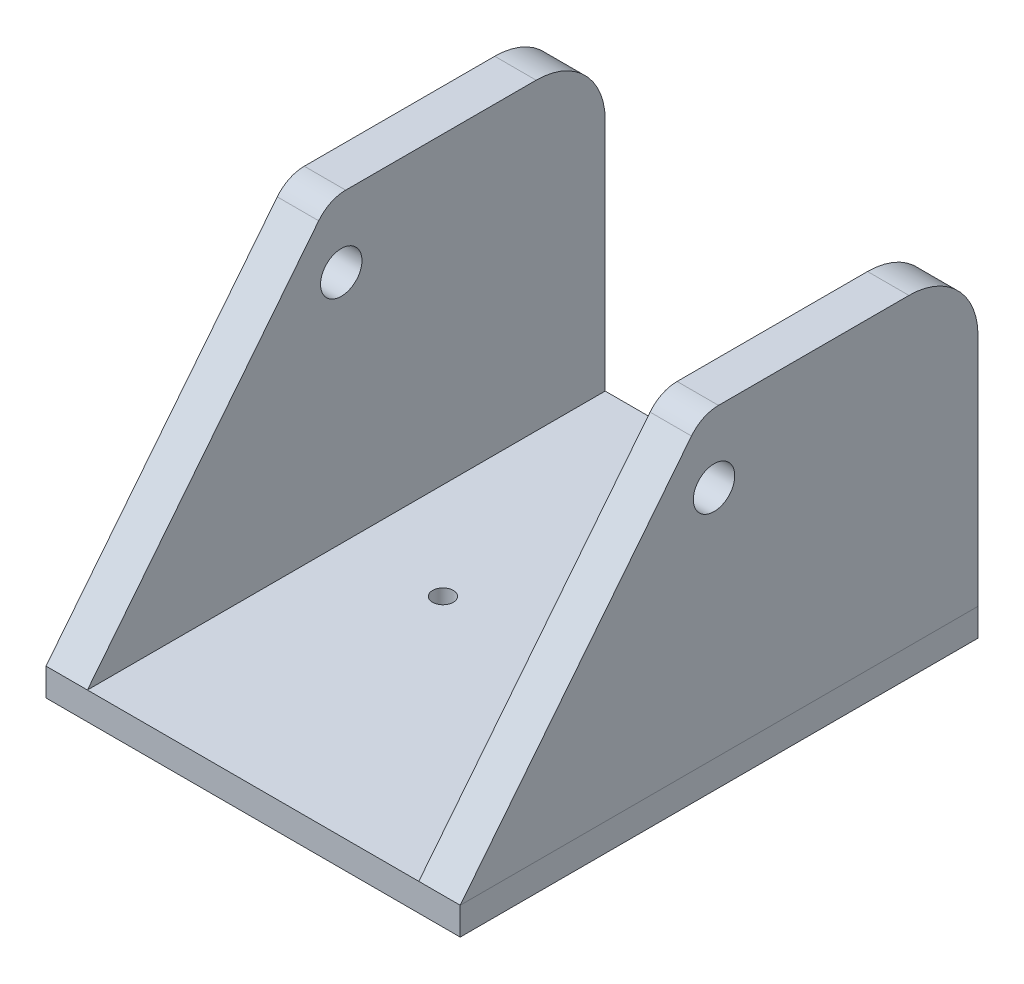
ISO-10303-21;
HEADER;
FILE_DESCRIPTION(('STEP AP214'),'2;1');
FILE_NAME('part.step','',(''),(''),'','','');
FILE_SCHEMA(('AUTOMOTIVE_DESIGN { 1 0 10303 214 1 1 1 1 }'));
ENDSEC;
DATA;
#1=APPLICATION_CONTEXT('core data for automotive mechanical design processes');
#2=APPLICATION_PROTOCOL_DEFINITION('international standard','automotive_design',2000,#1);
#3=PRODUCT_CONTEXT('',#1,'mechanical');
#4=PRODUCT('Part','Part','',(#3));
#5=PRODUCT_RELATED_PRODUCT_CATEGORY('part','',(#4));
#6=PRODUCT_DEFINITION_FORMATION('','',#4);
#7=PRODUCT_DEFINITION_CONTEXT('part definition',#1,'design');
#8=PRODUCT_DEFINITION('design','',#6,#7);
#9=PRODUCT_DEFINITION_SHAPE('','',#8);
#10=(LENGTH_UNIT() NAMED_UNIT(*) SI_UNIT(.MILLI.,.METRE.));
#11=(NAMED_UNIT(*) PLANE_ANGLE_UNIT() SI_UNIT($,.RADIAN.));
#12=(NAMED_UNIT(*) SI_UNIT($,.STERADIAN.) SOLID_ANGLE_UNIT());
#13=UNCERTAINTY_MEASURE_WITH_UNIT(LENGTH_MEASURE(1.E-05),#10,'distance_accuracy_value','');
#14=(GEOMETRIC_REPRESENTATION_CONTEXT(3) GLOBAL_UNCERTAINTY_ASSIGNED_CONTEXT((#13)) GLOBAL_UNIT_ASSIGNED_CONTEXT((#10,
#11,#12)) REPRESENTATION_CONTEXT('',''));
#15=CARTESIAN_POINT('',(0.,0.,0.));
#16=DIRECTION('',(0.,0.,1.));
#17=DIRECTION('',(1.,0.,0.));
#18=AXIS2_PLACEMENT_3D('',#15,#16,#17);
#19=CARTESIAN_POINT('',(-24.,4.,0.));
#20=DIRECTION('',(0.,1.,0.));
#21=DIRECTION('',(0.,0.,1.));
#22=AXIS2_PLACEMENT_3D('',#19,#20,#21);
#23=PLANE('',#22);
#24=DIRECTION('',(1.,0.,0.));
#25=VECTOR('',#24,1.);
#26=CARTESIAN_POINT('',(30.,4.,0.));
#27=LINE('',#26,#25);
#28=CARTESIAN_POINT('',(-30.,4.,0.));
#29=VERTEX_POINT('',#28);
#30=CARTESIAN_POINT('',(30.,4.,0.));
#31=VERTEX_POINT('',#30);
#32=EDGE_CURVE('E105',#29,#31,#27,.T.);
#33=ORIENTED_EDGE('',*,*,#32,.T.);
#34=DIRECTION('',(0.,0.,-1.));
#35=VECTOR('',#34,1.);
#36=CARTESIAN_POINT('',(30.,4.,0.));
#37=LINE('',#36,#35);
#38=CARTESIAN_POINT('',(30.,4.,-74.9999999999999));
#39=VERTEX_POINT('',#38);
#40=EDGE_CURVE('E108',#31,#39,#37,.T.);
#41=ORIENTED_EDGE('',*,*,#40,.T.);
#42=DIRECTION('',(-1.,0.,0.));
#43=VECTOR('',#42,1.);
#44=CARTESIAN_POINT('',(-30.,4.,-75.));
#45=LINE('',#44,#43);
#46=CARTESIAN_POINT('',(-30.,4.,-75.));
#47=VERTEX_POINT('',#46);
#48=EDGE_CURVE('E113',#39,#47,#45,.T.);
#49=ORIENTED_EDGE('',*,*,#48,.T.);
#50=DIRECTION('',(0.,0.,1.));
#51=VECTOR('',#50,1.);
#52=CARTESIAN_POINT('',(-30.,4.,0.));
#53=LINE('',#52,#51);
#54=EDGE_CURVE('E110',#47,#29,#53,.T.);
#55=ORIENTED_EDGE('',*,*,#54,.T.);
#56=EDGE_LOOP('',(#33,#41,#49,#55));
#57=FACE_BOUND('',#56,.T.);
#58=CARTESIAN_POINT('',(-9.99999999999999,4.,-37.5));
#59=DIRECTION('',(0.,-1.,0.));
#60=DIRECTION('',(0.,0.,-1.));
#61=AXIS2_PLACEMENT_3D('',#58,#59,#60);
#62=CIRCLE('',#61,1.5);
#63=CARTESIAN_POINT('',(-9.99999999999999,4.,-39.));
#64=VERTEX_POINT('',#63);
#65=EDGE_CURVE('E137',#64,#64,#62,.F.);
#66=ORIENTED_EDGE('',*,*,#65,.F.);
#67=EDGE_LOOP('',(#66));
#68=FACE_BOUND('',#67,.T.);
#69=CARTESIAN_POINT('',(10.,4.,-37.5));
#70=DIRECTION('',(0.,-1.,0.));
#71=DIRECTION('',(0.,0.,-1.));
#72=AXIS2_PLACEMENT_3D('',#69,#70,#71);
#73=CIRCLE('',#72,1.5);
#74=CARTESIAN_POINT('',(10.,4.,-39.));
#75=VERTEX_POINT('',#74);
#76=EDGE_CURVE('E133',#75,#75,#73,.F.);
#77=ORIENTED_EDGE('',*,*,#76,.F.);
#78=EDGE_LOOP('',(#77));
#79=FACE_BOUND('',#78,.T.);
#80=ADVANCED_FACE('F62',(#57,#68,#79),#23,.T.);
#81=CARTESIAN_POINT('',(-30.,4.,0.));
#82=DIRECTION('',(1.,0.,0.));
#83=DIRECTION('',(0.,0.,-1.));
#84=AXIS2_PLACEMENT_3D('',#81,#82,#83);
#85=PLANE('',#84);
#86=ORIENTED_EDGE('',*,*,#54,.F.);
#87=DIRECTION('',(0.,-1.,0.));
#88=VECTOR('',#87,1.);
#89=CARTESIAN_POINT('',(-30.,4.,-75.));
#90=LINE('',#89,#88);
#91=CARTESIAN_POINT('',(-30.,0.,-75.));
#92=VERTEX_POINT('',#91);
#93=EDGE_CURVE('E150',#47,#92,#90,.T.);
#94=ORIENTED_EDGE('',*,*,#93,.T.);
#95=DIRECTION('',(0.,0.,1.));
#96=VECTOR('',#95,1.);
#97=CARTESIAN_POINT('',(-30.,0.,0.));
#98=LINE('',#97,#96);
#99=CARTESIAN_POINT('',(-30.,0.,0.));
#100=VERTEX_POINT('',#99);
#101=EDGE_CURVE('E140',#92,#100,#98,.T.);
#102=ORIENTED_EDGE('',*,*,#101,.T.);
#103=DIRECTION('',(0.,-1.,0.));
#104=VECTOR('',#103,1.);
#105=CARTESIAN_POINT('',(-30.,4.,0.));
#106=LINE('',#105,#104);
#107=EDGE_CURVE('E120',#29,#100,#106,.T.);
#108=ORIENTED_EDGE('',*,*,#107,.F.);
#109=EDGE_LOOP('',(#86,#94,#102,#108));
#110=FACE_BOUND('',#109,.T.);
#111=ADVANCED_FACE('F64',(#110),#85,.F.);
#112=CARTESIAN_POINT('',(30.,4.,0.));
#113=DIRECTION('',(-1.,0.,0.));
#114=DIRECTION('',(0.,0.,1.));
#115=AXIS2_PLACEMENT_3D('',#112,#113,#114);
#116=PLANE('',#115);
#117=ORIENTED_EDGE('',*,*,#40,.F.);
#118=DIRECTION('',(0.,-1.,0.));
#119=VECTOR('',#118,1.);
#120=CARTESIAN_POINT('',(30.,4.,0.));
#121=LINE('',#120,#119);
#122=CARTESIAN_POINT('',(30.,0.,0.));
#123=VERTEX_POINT('',#122);
#124=EDGE_CURVE('E115',#31,#123,#121,.T.);
#125=ORIENTED_EDGE('',*,*,#124,.T.);
#126=DIRECTION('',(0.,0.,-1.));
#127=VECTOR('',#126,1.);
#128=CARTESIAN_POINT('',(30.,0.,0.));
#129=LINE('',#128,#127);
#130=CARTESIAN_POINT('',(30.,0.,-74.9999999999999));
#131=VERTEX_POINT('',#130);
#132=EDGE_CURVE('E153',#123,#131,#129,.T.);
#133=ORIENTED_EDGE('',*,*,#132,.T.);
#134=DIRECTION('',(0.,-1.,0.));
#135=VECTOR('',#134,1.);
#136=CARTESIAN_POINT('',(30.,4.,-74.9999999999999));
#137=LINE('',#136,#135);
#138=EDGE_CURVE('E119',#39,#131,#137,.T.);
#139=ORIENTED_EDGE('',*,*,#138,.F.);
#140=EDGE_LOOP('',(#117,#125,#133,#139));
#141=FACE_BOUND('',#140,.T.);
#142=ADVANCED_FACE('F123',(#141),#116,.F.);
#143=CARTESIAN_POINT('',(0.,0.,0.));
#144=DIRECTION('',(0.,-1.,0.));
#145=DIRECTION('',(0.,0.,-1.));
#146=AXIS2_PLACEMENT_3D('',#143,#144,#145);
#147=PLANE('',#146);
#148=CARTESIAN_POINT('',(-9.99999999999999,0.,-37.5));
#149=DIRECTION('',(0.,1.,0.));
#150=DIRECTION('',(0.,0.,1.));
#151=AXIS2_PLACEMENT_3D('',#148,#149,#150);
#152=CIRCLE('',#151,1.5);
#153=CARTESIAN_POINT('',(-9.99999999999999,0.,-39.));
#154=VERTEX_POINT('',#153);
#155=EDGE_CURVE('E71',#154,#154,#152,.T.);
#156=ORIENTED_EDGE('',*,*,#155,.T.);
#157=EDGE_LOOP('',(#156));
#158=FACE_BOUND('',#157,.T.);
#159=CARTESIAN_POINT('',(10.,0.,-37.5));
#160=DIRECTION('',(0.,1.,0.));
#161=DIRECTION('',(0.,0.,1.));
#162=AXIS2_PLACEMENT_3D('',#159,#160,#161);
#163=CIRCLE('',#162,1.5);
#164=CARTESIAN_POINT('',(10.,0.,-39.));
#165=VERTEX_POINT('',#164);
#166=EDGE_CURVE('E13',#165,#165,#163,.T.);
#167=ORIENTED_EDGE('',*,*,#166,.T.);
#168=EDGE_LOOP('',(#167));
#169=FACE_BOUND('',#168,.T.);
#170=ORIENTED_EDGE('',*,*,#101,.F.);
#171=DIRECTION('',(-1.,0.,0.));
#172=VECTOR('',#171,1.);
#173=CARTESIAN_POINT('',(-30.,0.,-75.));
#174=LINE('',#173,#172);
#175=EDGE_CURVE('E112',#131,#92,#174,.T.);
#176=ORIENTED_EDGE('',*,*,#175,.F.);
#177=ORIENTED_EDGE('',*,*,#132,.F.);
#178=DIRECTION('',(1.,0.,0.));
#179=VECTOR('',#178,1.);
#180=CARTESIAN_POINT('',(30.,0.,0.));
#181=LINE('',#180,#179);
#182=EDGE_CURVE('E79',#100,#123,#181,.T.);
#183=ORIENTED_EDGE('',*,*,#182,.F.);
#184=EDGE_LOOP('',(#170,#176,#177,#183));
#185=FACE_BOUND('',#184,.T.);
#186=ADVANCED_FACE('F159',(#158,#169,#185),#147,.T.);
#187=CARTESIAN_POINT('',(30.,4.,0.));
#188=DIRECTION('',(0.,0.,-1.));
#189=DIRECTION('',(-1.,0.,0.));
#190=AXIS2_PLACEMENT_3D('',#187,#188,#189);
#191=PLANE('',#190);
#192=ORIENTED_EDGE('',*,*,#182,.T.);
#193=ORIENTED_EDGE('',*,*,#124,.F.);
#194=ORIENTED_EDGE('',*,*,#32,.F.);
#195=ORIENTED_EDGE('',*,*,#107,.T.);
#196=EDGE_LOOP('',(#192,#193,#194,#195));
#197=FACE_BOUND('',#196,.T.);
#198=ADVANCED_FACE('F116',(#197),#191,.F.);
#199=CARTESIAN_POINT('',(-9.99999999999999,4.000012,-37.5));
#200=DIRECTION('',(0.,-1.,0.));
#201=DIRECTION('',(0.,0.,-1.));
#202=AXIS2_PLACEMENT_3D('',#199,#200,#201);
#203=CYLINDRICAL_SURFACE('',#202,1.5);
#204=CARTESIAN_POINT('',(-9.99999999999999,0.,-39.));
#205=CARTESIAN_POINT('',(-9.99999999999999,0.0416666666666666,-39.));
#206=CARTESIAN_POINT('',(-9.99999999999999,0.0833333333333331,-39.));
#207=CARTESIAN_POINT('',(-9.99999999999999,0.166666666666666,-39.));
#208=CARTESIAN_POINT('',(-9.99999999999999,0.208333333333333,-39.));
#209=CARTESIAN_POINT('',(-9.99999999999999,0.291666666666666,-39.));
#210=CARTESIAN_POINT('',(-9.99999999999999,0.333333333333333,-39.));
#211=CARTESIAN_POINT('',(-9.99999999999999,0.416666666666667,-39.));
#212=CARTESIAN_POINT('',(-9.99999999999999,0.458333333333333,-39.));
#213=CARTESIAN_POINT('',(-9.99999999999999,0.541666666666667,-39.));
#214=CARTESIAN_POINT('',(-9.99999999999999,0.583333333333333,-39.));
#215=CARTESIAN_POINT('',(-9.99999999999999,0.666666666666667,-39.));
#216=CARTESIAN_POINT('',(-9.99999999999999,0.708333333333333,-39.));
#217=CARTESIAN_POINT('',(-9.99999999999999,0.791666666666667,-39.));
#218=CARTESIAN_POINT('',(-9.99999999999999,0.833333333333333,-39.));
#219=CARTESIAN_POINT('',(-9.99999999999999,0.916666666666667,-39.));
#220=CARTESIAN_POINT('',(-9.99999999999999,0.958333333333333,-39.));
#221=CARTESIAN_POINT('',(-9.99999999999999,1.04166666666667,-39.));
#222=CARTESIAN_POINT('',(-9.99999999999999,1.08333333333333,-39.));
#223=CARTESIAN_POINT('',(-9.99999999999999,1.16666666666667,-39.));
#224=CARTESIAN_POINT('',(-9.99999999999999,1.20833333333333,-39.));
#225=CARTESIAN_POINT('',(-9.99999999999999,1.29166666666667,-39.));
#226=CARTESIAN_POINT('',(-9.99999999999999,1.33333333333333,-39.));
#227=CARTESIAN_POINT('',(-9.99999999999999,1.41666666666667,-39.));
#228=CARTESIAN_POINT('',(-9.99999999999999,1.45833333333333,-39.));
#229=CARTESIAN_POINT('',(-9.99999999999999,1.54166666666667,-39.));
#230=CARTESIAN_POINT('',(-9.99999999999999,1.58333333333333,-39.));
#231=CARTESIAN_POINT('',(-9.99999999999999,1.66666666666667,-39.));
#232=CARTESIAN_POINT('',(-9.99999999999999,1.70833333333333,-39.));
#233=CARTESIAN_POINT('',(-9.99999999999999,1.79166666666667,-39.));
#234=CARTESIAN_POINT('',(-9.99999999999999,1.83333333333333,-39.));
#235=CARTESIAN_POINT('',(-9.99999999999999,1.91666666666667,-39.));
#236=CARTESIAN_POINT('',(-9.99999999999999,1.95833333333333,-39.));
#237=CARTESIAN_POINT('',(-9.99999999999999,2.04166666666667,-39.));
#238=CARTESIAN_POINT('',(-9.99999999999999,2.08333333333333,-39.));
#239=CARTESIAN_POINT('',(-9.99999999999999,2.16666666666667,-39.));
#240=CARTESIAN_POINT('',(-9.99999999999999,2.20833333333333,-39.));
#241=CARTESIAN_POINT('',(-9.99999999999999,2.29166666666667,-39.));
#242=CARTESIAN_POINT('',(-9.99999999999999,2.33333333333333,-39.));
#243=CARTESIAN_POINT('',(-9.99999999999999,2.41666666666667,-39.));
#244=CARTESIAN_POINT('',(-9.99999999999999,2.45833333333333,-39.));
#245=CARTESIAN_POINT('',(-9.99999999999999,2.54166666666667,-39.));
#246=CARTESIAN_POINT('',(-9.99999999999999,2.58333333333333,-39.));
#247=CARTESIAN_POINT('',(-9.99999999999999,2.66666666666667,-39.));
#248=CARTESIAN_POINT('',(-9.99999999999999,2.70833333333333,-39.));
#249=CARTESIAN_POINT('',(-9.99999999999999,2.79166666666667,-39.));
#250=CARTESIAN_POINT('',(-9.99999999999999,2.83333333333333,-39.));
#251=CARTESIAN_POINT('',(-9.99999999999999,2.91666666666667,-39.));
#252=CARTESIAN_POINT('',(-9.99999999999999,2.95833333333333,-39.));
#253=CARTESIAN_POINT('',(-9.99999999999999,3.04166666666667,-39.));
#254=CARTESIAN_POINT('',(-9.99999999999999,3.08333333333333,-39.));
#255=CARTESIAN_POINT('',(-9.99999999999999,3.16666666666667,-39.));
#256=CARTESIAN_POINT('',(-9.99999999999999,3.20833333333333,-39.));
#257=CARTESIAN_POINT('',(-9.99999999999999,3.29166666666667,-39.));
#258=CARTESIAN_POINT('',(-9.99999999999999,3.33333333333333,-39.));
#259=CARTESIAN_POINT('',(-9.99999999999999,3.41666666666667,-39.));
#260=CARTESIAN_POINT('',(-9.99999999999999,3.45833333333333,-39.));
#261=CARTESIAN_POINT('',(-9.99999999999999,3.54166666666667,-39.));
#262=CARTESIAN_POINT('',(-9.99999999999999,3.58333333333333,-39.));
#263=CARTESIAN_POINT('',(-9.99999999999999,3.66666666666667,-39.));
#264=CARTESIAN_POINT('',(-9.99999999999999,3.70833333333333,-39.));
#265=CARTESIAN_POINT('',(-9.99999999999999,3.79166666666667,-39.));
#266=CARTESIAN_POINT('',(-9.99999999999999,3.83333333333333,-39.));
#267=CARTESIAN_POINT('',(-9.99999999999999,3.91666666666667,-39.));
#268=CARTESIAN_POINT('',(-9.99999999999999,3.95833333333333,-39.));
#269=CARTESIAN_POINT('',(-9.99999999999999,4.,-39.));
#270=B_SPLINE_CURVE_WITH_KNOTS('',3,(#204,#205,#206,#207,#208,#209,#210,#211,#212,#213,#214,
#215,#216,#217,#218,#219,#220,#221,#222,#223,#224,#225,#226,#227,#228,#229,#230,#231,#232,#233,
#234,#235,#236,#237,#238,#239,#240,#241,#242,#243,#244,#245,#246,#247,#248,#249,#250,#251,#252,
#253,#254,#255,#256,#257,#258,#259,#260,#261,#262,#263,#264,#265,#266,#267,#268,#269),
.UNSPECIFIED.,.F.,.F.,(4,2,2,2,2,2,2,2,2,2,2,2,2,2,2,2,2,2,2,2,2,2,2,2,2,2,2,2,2,2,2,2,4),(0.,
0.125,0.25,0.375,0.5,0.625,0.75,0.875,1.,1.125,1.25,1.375,1.5,1.625,1.75,1.875,2.,2.125,2.25,
2.375,2.5,2.625,2.75,2.875,3.,3.125,3.25,3.375,3.5,3.625,3.75,3.875,4.),.UNSPECIFIED.);
#271=EDGE_CURVE('BSEAM167',#154,#64,#270,.T.);
#272=ORIENTED_EDGE('',*,*,#155,.F.);
#273=ORIENTED_EDGE('',*,*,#65,.T.);
#274=ORIENTED_EDGE('',*,*,#271,.T.);
#275=ORIENTED_EDGE('',*,*,#271,.F.);
#276=EDGE_LOOP('',(#272,#274,#273,#275));
#277=FACE_BOUND('',#276,.T.);
#278=ADVANCED_FACE('F167',(#277),#203,.F.);
#279=CARTESIAN_POINT('',(10.,4.000012,-37.5));
#280=DIRECTION('',(0.,-1.,0.));
#281=DIRECTION('',(0.,0.,-1.));
#282=AXIS2_PLACEMENT_3D('',#279,#280,#281);
#283=CYLINDRICAL_SURFACE('',#282,1.5);
#284=CARTESIAN_POINT('',(10.,0.,-39.));
#285=CARTESIAN_POINT('',(10.,0.0416666666666666,-39.));
#286=CARTESIAN_POINT('',(10.,0.0833333333333331,-39.));
#287=CARTESIAN_POINT('',(10.,0.166666666666666,-39.));
#288=CARTESIAN_POINT('',(10.,0.208333333333333,-39.));
#289=CARTESIAN_POINT('',(10.,0.291666666666666,-39.));
#290=CARTESIAN_POINT('',(10.,0.333333333333333,-39.));
#291=CARTESIAN_POINT('',(10.,0.416666666666667,-39.));
#292=CARTESIAN_POINT('',(10.,0.458333333333333,-39.));
#293=CARTESIAN_POINT('',(10.,0.541666666666667,-39.));
#294=CARTESIAN_POINT('',(10.,0.583333333333333,-39.));
#295=CARTESIAN_POINT('',(10.,0.666666666666667,-39.));
#296=CARTESIAN_POINT('',(10.,0.708333333333333,-39.));
#297=CARTESIAN_POINT('',(10.,0.791666666666667,-39.));
#298=CARTESIAN_POINT('',(10.,0.833333333333333,-39.));
#299=CARTESIAN_POINT('',(10.,0.916666666666667,-39.));
#300=CARTESIAN_POINT('',(10.,0.958333333333333,-39.));
#301=CARTESIAN_POINT('',(10.,1.04166666666667,-39.));
#302=CARTESIAN_POINT('',(10.,1.08333333333333,-39.));
#303=CARTESIAN_POINT('',(10.,1.16666666666667,-39.));
#304=CARTESIAN_POINT('',(10.,1.20833333333333,-39.));
#305=CARTESIAN_POINT('',(10.,1.29166666666667,-39.));
#306=CARTESIAN_POINT('',(10.,1.33333333333333,-39.));
#307=CARTESIAN_POINT('',(10.,1.41666666666667,-39.));
#308=CARTESIAN_POINT('',(10.,1.45833333333333,-39.));
#309=CARTESIAN_POINT('',(10.,1.54166666666667,-39.));
#310=CARTESIAN_POINT('',(10.,1.58333333333333,-39.));
#311=CARTESIAN_POINT('',(10.,1.66666666666667,-39.));
#312=CARTESIAN_POINT('',(10.,1.70833333333333,-39.));
#313=CARTESIAN_POINT('',(10.,1.79166666666667,-39.));
#314=CARTESIAN_POINT('',(10.,1.83333333333333,-39.));
#315=CARTESIAN_POINT('',(10.,1.91666666666667,-39.));
#316=CARTESIAN_POINT('',(10.,1.95833333333333,-39.));
#317=CARTESIAN_POINT('',(10.,2.04166666666667,-39.));
#318=CARTESIAN_POINT('',(10.,2.08333333333333,-39.));
#319=CARTESIAN_POINT('',(10.,2.16666666666667,-39.));
#320=CARTESIAN_POINT('',(10.,2.20833333333333,-39.));
#321=CARTESIAN_POINT('',(10.,2.29166666666667,-39.));
#322=CARTESIAN_POINT('',(10.,2.33333333333333,-39.));
#323=CARTESIAN_POINT('',(10.,2.41666666666667,-39.));
#324=CARTESIAN_POINT('',(10.,2.45833333333333,-39.));
#325=CARTESIAN_POINT('',(10.,2.54166666666667,-39.));
#326=CARTESIAN_POINT('',(10.,2.58333333333333,-39.));
#327=CARTESIAN_POINT('',(10.,2.66666666666667,-39.));
#328=CARTESIAN_POINT('',(10.,2.70833333333333,-39.));
#329=CARTESIAN_POINT('',(10.,2.79166666666667,-39.));
#330=CARTESIAN_POINT('',(10.,2.83333333333333,-39.));
#331=CARTESIAN_POINT('',(10.,2.91666666666667,-39.));
#332=CARTESIAN_POINT('',(10.,2.95833333333333,-39.));
#333=CARTESIAN_POINT('',(10.,3.04166666666667,-39.));
#334=CARTESIAN_POINT('',(10.,3.08333333333333,-39.));
#335=CARTESIAN_POINT('',(10.,3.16666666666667,-39.));
#336=CARTESIAN_POINT('',(10.,3.20833333333333,-39.));
#337=CARTESIAN_POINT('',(10.,3.29166666666667,-39.));
#338=CARTESIAN_POINT('',(10.,3.33333333333333,-39.));
#339=CARTESIAN_POINT('',(10.,3.41666666666667,-39.));
#340=CARTESIAN_POINT('',(10.,3.45833333333333,-39.));
#341=CARTESIAN_POINT('',(10.,3.54166666666667,-39.));
#342=CARTESIAN_POINT('',(10.,3.58333333333333,-39.));
#343=CARTESIAN_POINT('',(10.,3.66666666666667,-39.));
#344=CARTESIAN_POINT('',(10.,3.70833333333333,-39.));
#345=CARTESIAN_POINT('',(10.,3.79166666666667,-39.));
#346=CARTESIAN_POINT('',(10.,3.83333333333333,-39.));
#347=CARTESIAN_POINT('',(10.,3.91666666666667,-39.));
#348=CARTESIAN_POINT('',(10.,3.95833333333333,-39.));
#349=CARTESIAN_POINT('',(10.,4.,-39.));
#350=B_SPLINE_CURVE_WITH_KNOTS('',3,(#284,#285,#286,#287,#288,#289,#290,#291,#292,#293,#294,
#295,#296,#297,#298,#299,#300,#301,#302,#303,#304,#305,#306,#307,#308,#309,#310,#311,#312,#313,
#314,#315,#316,#317,#318,#319,#320,#321,#322,#323,#324,#325,#326,#327,#328,#329,#330,#331,#332,
#333,#334,#335,#336,#337,#338,#339,#340,#341,#342,#343,#344,#345,#346,#347,#348,#349),
.UNSPECIFIED.,.F.,.F.,(4,2,2,2,2,2,2,2,2,2,2,2,2,2,2,2,2,2,2,2,2,2,2,2,2,2,2,2,2,2,2,2,4),(0.,
0.125,0.25,0.375,0.5,0.625,0.75,0.875,1.,1.125,1.25,1.375,1.5,1.625,1.75,1.875,2.,2.125,2.25,
2.375,2.5,2.625,2.75,2.875,3.,3.125,3.25,3.375,3.5,3.625,3.75,3.875,4.),.UNSPECIFIED.);
#351=EDGE_CURVE('BSEAM163',#165,#75,#350,.T.);
#352=ORIENTED_EDGE('',*,*,#166,.F.);
#353=ORIENTED_EDGE('',*,*,#76,.T.);
#354=ORIENTED_EDGE('',*,*,#351,.T.);
#355=ORIENTED_EDGE('',*,*,#351,.F.);
#356=EDGE_LOOP('',(#352,#354,#353,#355));
#357=FACE_BOUND('',#356,.T.);
#358=ADVANCED_FACE('F163',(#357),#283,.F.);
#359=CARTESIAN_POINT('',(-30.,4.,-75.));
#360=DIRECTION('',(0.,0.,1.));
#361=DIRECTION('',(1.,0.,0.));
#362=AXIS2_PLACEMENT_3D('',#359,#360,#361);
#363=PLANE('',#362);
#364=ORIENTED_EDGE('',*,*,#48,.F.);
#365=ORIENTED_EDGE('',*,*,#138,.T.);
#366=ORIENTED_EDGE('',*,*,#175,.T.);
#367=ORIENTED_EDGE('',*,*,#93,.F.);
#368=EDGE_LOOP('',(#364,#365,#366,#367));
#369=FACE_BOUND('',#368,.T.);
#370=ADVANCED_FACE('F161',(#369),#363,.F.);
#371=CLOSED_SHELL('',(#80,#111,#142,#186,#198,#278,#358,#370));
#372=MANIFOLD_SOLID_BREP('B2',#371);
#373=CARTESIAN_POINT('',(-24.,4.,0.));
#374=DIRECTION('',(0.,1.,0.));
#375=DIRECTION('',(0.,0.,1.));
#376=AXIS2_PLACEMENT_3D('',#373,#374,#375);
#377=PLANE('',#376);
#378=DIRECTION('',(-1.,0.,0.));
#379=VECTOR('',#378,1.);
#380=CARTESIAN_POINT('',(-30.,4.,-75.));
#381=LINE('',#380,#379);
#382=CARTESIAN_POINT('',(-24.,4.,-75.));
#383=VERTEX_POINT('',#382);
#384=CARTESIAN_POINT('',(-30.,4.,-75.));
#385=VERTEX_POINT('',#384);
#386=EDGE_CURVE('E335',#383,#385,#381,.T.);
#387=ORIENTED_EDGE('',*,*,#386,.F.);
#388=DIRECTION('',(0.,0.,1.));
#389=VECTOR('',#388,1.);
#390=CARTESIAN_POINT('',(-24.,4.,-74.9999999999999));
#391=LINE('',#390,#389);
#392=CARTESIAN_POINT('',(-24.,4.,0.));
#393=VERTEX_POINT('',#392);
#394=EDGE_CURVE('E333',#383,#393,#391,.T.);
#395=ORIENTED_EDGE('',*,*,#394,.T.);
#396=DIRECTION('',(1.,0.,0.));
#397=VECTOR('',#396,1.);
#398=CARTESIAN_POINT('',(0.,4.,0.));
#399=LINE('',#398,#397);
#400=CARTESIAN_POINT('',(-30.,4.,0.));
#401=VERTEX_POINT('',#400);
#402=EDGE_CURVE('E321',#401,#393,#399,.T.);
#403=ORIENTED_EDGE('',*,*,#402,.F.);
#404=DIRECTION('',(0.,0.,1.));
#405=VECTOR('',#404,1.);
#406=CARTESIAN_POINT('',(-30.,4.,0.));
#407=LINE('',#406,#405);
#408=EDGE_CURVE('E282',#385,#401,#407,.T.);
#409=ORIENTED_EDGE('',*,*,#408,.F.);
#410=EDGE_LOOP('',(#387,#395,#403,#409));
#411=FACE_BOUND('',#410,.T.);
#412=ADVANCED_FACE('F266',(#411),#377,.F.);
#413=CARTESIAN_POINT('',(0.,48.,0.));
#414=DIRECTION('',(0.,-1.,0.));
#415=DIRECTION('',(0.,0.,-1.));
#416=AXIS2_PLACEMENT_3D('',#413,#414,#415);
#417=PLANE('',#416);
#418=DIRECTION('',(0.,0.,1.));
#419=VECTOR('',#418,1.);
#420=CARTESIAN_POINT('',(-24.,48.,-74.9999999999999));
#421=LINE('',#420,#419);
#422=CARTESIAN_POINT('',(-24.,48.,-65.));
#423=VERTEX_POINT('',#422);
#424=CARTESIAN_POINT('',(-24.,48.,-37.411678544032));
#425=VERTEX_POINT('',#424);
#426=EDGE_CURVE('E329',#423,#425,#421,.T.);
#427=ORIENTED_EDGE('',*,*,#426,.F.);
#428=DIRECTION('',(1.,0.,0.));
#429=VECTOR('',#428,1.);
#430=CARTESIAN_POINT('',(0.,48.,-65.));
#431=LINE('',#430,#429);
#432=CARTESIAN_POINT('',(-30.,48.,-65.));
#433=VERTEX_POINT('',#432);
#434=EDGE_CURVE('E448',#423,#433,#431,.F.);
#435=ORIENTED_EDGE('',*,*,#434,.T.);
#436=DIRECTION('',(0.,0.,-1.));
#437=VECTOR('',#436,1.);
#438=CARTESIAN_POINT('',(-30.,48.,-34.9999999999999));
#439=LINE('',#438,#437);
#440=CARTESIAN_POINT('',(-30.,48.,-37.411678544032));
#441=VERTEX_POINT('',#440);
#442=EDGE_CURVE('E343',#441,#433,#439,.T.);
#443=ORIENTED_EDGE('',*,*,#442,.F.);
#444=DIRECTION('',(-1.,0.,0.));
#445=VECTOR('',#444,1.);
#446=CARTESIAN_POINT('',(-24.,48.,-37.411678544032));
#447=LINE('',#446,#445);
#448=EDGE_CURVE('E457',#441,#425,#447,.F.);
#449=ORIENTED_EDGE('',*,*,#448,.T.);
#450=EDGE_LOOP('',(#427,#435,#443,#449));
#451=FACE_BOUND('',#450,.T.);
#452=ADVANCED_FACE('F371',(#451),#417,.F.);
#453=CARTESIAN_POINT('',(-30.,38.,-65.));
#454=DIRECTION('',(1.,0.,0.));
#455=DIRECTION('',(0.,0.,-1.));
#456=AXIS2_PLACEMENT_3D('',#453,#454,#455);
#457=CYLINDRICAL_SURFACE('',#456,10.);
#458=CARTESIAN_POINT('',(-30.,38.,-65.));
#459=DIRECTION('',(1.,0.,0.));
#460=DIRECTION('',(0.,0.,-1.));
#461=AXIS2_PLACEMENT_3D('',#458,#459,#460);
#462=CIRCLE('',#461,10.);
#463=CARTESIAN_POINT('',(-30.,38.,-75.));
#464=VERTEX_POINT('',#463);
#465=EDGE_CURVE('E353',#433,#464,#462,.F.);
#466=ORIENTED_EDGE('',*,*,#465,.F.);
#467=ORIENTED_EDGE('',*,*,#434,.F.);
#468=CARTESIAN_POINT('',(-24.,38.,-65.));
#469=DIRECTION('',(1.,0.,0.));
#470=DIRECTION('',(0.,0.,-1.));
#471=AXIS2_PLACEMENT_3D('',#468,#469,#470);
#472=CIRCLE('',#471,10.);
#473=CARTESIAN_POINT('',(-24.,38.,-74.9999999999999));
#474=VERTEX_POINT('',#473);
#475=EDGE_CURVE('E412',#474,#423,#472,.T.);
#476=ORIENTED_EDGE('',*,*,#475,.F.);
#477=DIRECTION('',(1.,0.,0.));
#478=VECTOR('',#477,1.);
#479=CARTESIAN_POINT('',(-30.,38.,-75.));
#480=LINE('',#479,#478);
#481=EDGE_CURVE('E409',#464,#474,#480,.T.);
#482=ORIENTED_EDGE('',*,*,#481,.F.);
#483=EDGE_LOOP('',(#466,#467,#476,#482));
#484=FACE_BOUND('',#483,.T.);
#485=ADVANCED_FACE('F381',(#484),#457,.T.);
#486=CARTESIAN_POINT('',(-30.,4.,-75.));
#487=DIRECTION('',(0.,0.,1.));
#488=DIRECTION('',(1.,0.,0.));
#489=AXIS2_PLACEMENT_3D('',#486,#487,#488);
#490=PLANE('',#489);
#491=DIRECTION('',(0.,1.,0.));
#492=VECTOR('',#491,1.);
#493=CARTESIAN_POINT('',(-24.,4.,-74.9999999999999));
#494=LINE('',#493,#492);
#495=EDGE_CURVE('E340',#383,#474,#494,.T.);
#496=ORIENTED_EDGE('',*,*,#495,.F.);
#497=ORIENTED_EDGE('',*,*,#386,.T.);
#498=DIRECTION('',(0.,-1.,0.));
#499=VECTOR('',#498,1.);
#500=CARTESIAN_POINT('',(-30.,4.,-75.));
#501=LINE('',#500,#499);
#502=EDGE_CURVE('E330',#464,#385,#501,.T.);
#503=ORIENTED_EDGE('',*,*,#502,.F.);
#504=ORIENTED_EDGE('',*,*,#481,.T.);
#505=EDGE_LOOP('',(#496,#497,#503,#504));
#506=FACE_BOUND('',#505,.T.);
#507=ADVANCED_FACE('F394',(#506),#490,.F.);
#508=CARTESIAN_POINT('',(44.,38.,-36.7665526420069));
#509=DIRECTION('',(-1.,0.,0.));
#510=DIRECTION('',(0.,0.,1.));
#511=AXIS2_PLACEMENT_3D('',#508,#509,#510);
#512=CYLINDRICAL_SURFACE('',#511,3.);
#513=CARTESIAN_POINT('',(-24.,38.,-36.7665526420069));
#514=DIRECTION('',(1.,0.,0.));
#515=DIRECTION('',(0.,0.,-1.));
#516=AXIS2_PLACEMENT_3D('',#513,#514,#515);
#517=CIRCLE('',#516,3.);
#518=CARTESIAN_POINT('',(-24.,38.,-39.7665526420069));
#519=VERTEX_POINT('',#518);
#520=EDGE_CURVE('E274',#519,#519,#517,.T.);
#521=ORIENTED_EDGE('',*,*,#520,.T.);
#522=EDGE_LOOP('',(#521));
#523=FACE_BOUND('',#522,.T.);
#524=CARTESIAN_POINT('',(-30.,38.,-36.7665526420069));
#525=DIRECTION('',(-1.,0.,0.));
#526=DIRECTION('',(0.,0.,1.));
#527=AXIS2_PLACEMENT_3D('',#524,#525,#526);
#528=CIRCLE('',#527,3.);
#529=CARTESIAN_POINT('',(-30.,38.,-33.7665526420069));
#530=VERTEX_POINT('',#529);
#531=EDGE_CURVE('E60',#530,#530,#528,.T.);
#532=ORIENTED_EDGE('',*,*,#531,.T.);
#533=EDGE_LOOP('',(#532));
#534=FACE_BOUND('',#533,.T.);
#535=ADVANCED_FACE('F437',(#523,#534),#512,.F.);
#536=CARTESIAN_POINT('',(-30.,4.,0.));
#537=DIRECTION('',(1.,0.,0.));
#538=DIRECTION('',(0.,0.,-1.));
#539=AXIS2_PLACEMENT_3D('',#536,#537,#538);
#540=PLANE('',#539);
#541=ORIENTED_EDGE('',*,*,#531,.F.);
#542=EDGE_LOOP('',(#541));
#543=FACE_BOUND('',#542,.T.);
#544=ORIENTED_EDGE('',*,*,#502,.T.);
#545=ORIENTED_EDGE('',*,*,#408,.T.);
#546=DIRECTION('',(0.,0.782601054175649,-0.622523565821538));
#547=VECTOR('',#546,1.);
#548=CARTESIAN_POINT('',(-30.,4.,0.));
#549=LINE('',#548,#547);
#550=CARTESIAN_POINT('',(-30.,46.1126178291077,-33.4986732731538));
#551=VERTEX_POINT('',#550);
#552=EDGE_CURVE('E327',#401,#551,#549,.T.);
#553=ORIENTED_EDGE('',*,*,#552,.T.);
#554=CARTESIAN_POINT('',(-30.,43.,-37.411678544032));
#555=DIRECTION('',(1.,0.,0.));
#556=DIRECTION('',(0.,0.,-1.));
#557=AXIS2_PLACEMENT_3D('',#554,#555,#556);
#558=CIRCLE('',#557,5.);
#559=EDGE_CURVE('E433',#551,#441,#558,.F.);
#560=ORIENTED_EDGE('',*,*,#559,.T.);
#561=ORIENTED_EDGE('',*,*,#442,.T.);
#562=ORIENTED_EDGE('',*,*,#465,.T.);
#563=EDGE_LOOP('',(#544,#545,#553,#560,#561,#562));
#564=FACE_BOUND('',#563,.T.);
#565=ADVANCED_FACE('F383',(#543,#564),#540,.F.);
#566=CARTESIAN_POINT('',(0.,43.,-37.411678544032));
#567=DIRECTION('',(1.,0.,0.));
#568=DIRECTION('',(0.,0.,-1.));
#569=AXIS2_PLACEMENT_3D('',#566,#567,#568);
#570=CYLINDRICAL_SURFACE('',#569,5.);
#571=CARTESIAN_POINT('',(-24.,43.,-37.411678544032));
#572=DIRECTION('',(1.,0.,0.));
#573=DIRECTION('',(0.,0.,-1.));
#574=AXIS2_PLACEMENT_3D('',#571,#572,#573);
#575=CIRCLE('',#574,5.);
#576=CARTESIAN_POINT('',(-24.,46.1126178291077,-33.4986732731538));
#577=VERTEX_POINT('',#576);
#578=EDGE_CURVE('E290',#425,#577,#575,.T.);
#579=ORIENTED_EDGE('',*,*,#578,.F.);
#580=ORIENTED_EDGE('',*,*,#448,.F.);
#581=ORIENTED_EDGE('',*,*,#559,.F.);
#582=DIRECTION('',(-1.,0.,0.));
#583=VECTOR('',#582,1.);
#584=CARTESIAN_POINT('',(-30.,46.1126178291077,-33.4986732731538));
#585=LINE('',#584,#583);
#586=EDGE_CURVE('E414',#577,#551,#585,.T.);
#587=ORIENTED_EDGE('',*,*,#586,.F.);
#588=EDGE_LOOP('',(#579,#580,#581,#587));
#589=FACE_BOUND('',#588,.T.);
#590=ADVANCED_FACE('F392',(#589),#570,.T.);
#591=CARTESIAN_POINT('',(-24.,0.,0.));
#592=DIRECTION('',(1.,0.,0.));
#593=DIRECTION('',(0.,0.,-1.));
#594=AXIS2_PLACEMENT_3D('',#591,#592,#593);
#595=PLANE('',#594);
#596=ORIENTED_EDGE('',*,*,#520,.F.);
#597=EDGE_LOOP('',(#596));
#598=FACE_BOUND('',#597,.T.);
#599=ORIENTED_EDGE('',*,*,#495,.T.);
#600=ORIENTED_EDGE('',*,*,#475,.T.);
#601=ORIENTED_EDGE('',*,*,#426,.T.);
#602=ORIENTED_EDGE('',*,*,#578,.T.);
#603=DIRECTION('',(0.,0.782601054175649,-0.622523565821538));
#604=VECTOR('',#603,1.);
#605=CARTESIAN_POINT('',(-24.,4.,0.));
#606=LINE('',#605,#604);
#607=EDGE_CURVE('E325',#393,#577,#606,.T.);
#608=ORIENTED_EDGE('',*,*,#607,.F.);
#609=ORIENTED_EDGE('',*,*,#394,.F.);
#610=EDGE_LOOP('',(#599,#600,#601,#602,#608,#609));
#611=FACE_BOUND('',#610,.T.);
#612=ADVANCED_FACE('F339',(#598,#611),#595,.T.);
#613=CARTESIAN_POINT('',(0.,1.55014236001265,1.94875039544448));
#614=DIRECTION('',(0.,0.622523565821538,0.782601054175649));
#615=DIRECTION('',(0.,-0.782601054175649,0.622523565821538));
#616=AXIS2_PLACEMENT_3D('',#613,#614,#615);
#617=PLANE('',#616);
#618=ORIENTED_EDGE('',*,*,#607,.T.);
#619=ORIENTED_EDGE('',*,*,#586,.T.);
#620=ORIENTED_EDGE('',*,*,#552,.F.);
#621=ORIENTED_EDGE('',*,*,#402,.T.);
#622=EDGE_LOOP('',(#618,#619,#620,#621));
#623=FACE_BOUND('',#622,.T.);
#624=ADVANCED_FACE('F323',(#623),#617,.T.);
#625=CLOSED_SHELL('',(#412,#452,#485,#507,#535,#565,#590,#612,#624));
#626=MANIFOLD_SOLID_BREP('B7',#625);
#627=CARTESIAN_POINT('',(-24.,4.,0.));
#628=DIRECTION('',(0.,1.,0.));
#629=DIRECTION('',(0.,0.,1.));
#630=AXIS2_PLACEMENT_3D('',#627,#628,#629);
#631=PLANE('',#630);
#632=DIRECTION('',(1.,0.,0.));
#633=VECTOR('',#632,1.);
#634=CARTESIAN_POINT('',(24.,4.,0.));
#635=LINE('',#634,#633);
#636=CARTESIAN_POINT('',(24.,4.,0.));
#637=VERTEX_POINT('',#636);
#638=CARTESIAN_POINT('',(30.,4.,0.));
#639=VERTEX_POINT('',#638);
#640=EDGE_CURVE('E604',#637,#639,#635,.T.);
#641=ORIENTED_EDGE('',*,*,#640,.F.);
#642=DIRECTION('',(0.,0.,1.));
#643=VECTOR('',#642,1.);
#644=CARTESIAN_POINT('',(24.,4.,-74.9999999999999));
#645=LINE('',#644,#643);
#646=CARTESIAN_POINT('',(24.,4.,-74.9999999999999));
#647=VERTEX_POINT('',#646);
#648=EDGE_CURVE('E593',#647,#637,#645,.T.);
#649=ORIENTED_EDGE('',*,*,#648,.F.);
#650=DIRECTION('',(-1.,0.,0.));
#651=VECTOR('',#650,1.);
#652=CARTESIAN_POINT('',(-30.,4.,-75.));
#653=LINE('',#652,#651);
#654=CARTESIAN_POINT('',(30.,4.,-74.9999999999999));
#655=VERTEX_POINT('',#654);
#656=EDGE_CURVE('E547',#655,#647,#653,.T.);
#657=ORIENTED_EDGE('',*,*,#656,.F.);
#658=DIRECTION('',(0.,0.,-1.));
#659=VECTOR('',#658,1.);
#660=CARTESIAN_POINT('',(30.,4.,0.));
#661=LINE('',#660,#659);
#662=EDGE_CURVE('E264',#639,#655,#661,.T.);
#663=ORIENTED_EDGE('',*,*,#662,.F.);
#664=EDGE_LOOP('',(#641,#649,#657,#663));
#665=FACE_BOUND('',#664,.T.);
#666=ADVANCED_FACE('F539',(#665),#631,.F.);
#667=CARTESIAN_POINT('',(-30.,4.,-75.));
#668=DIRECTION('',(0.,0.,1.));
#669=DIRECTION('',(1.,0.,0.));
#670=AXIS2_PLACEMENT_3D('',#667,#668,#669);
#671=PLANE('',#670);
#672=DIRECTION('',(0.,-1.,0.));
#673=VECTOR('',#672,1.);
#674=CARTESIAN_POINT('',(30.,4.,-74.9999999999999));
#675=LINE('',#674,#673);
#676=CARTESIAN_POINT('',(30.,38.,-74.9999999999999));
#677=VERTEX_POINT('',#676);
#678=EDGE_CURVE('E709',#677,#655,#675,.T.);
#679=ORIENTED_EDGE('',*,*,#678,.T.);
#680=ORIENTED_EDGE('',*,*,#656,.T.);
#681=DIRECTION('',(0.,1.,0.));
#682=VECTOR('',#681,1.);
#683=CARTESIAN_POINT('',(24.,4.,-74.9999999999999));
#684=LINE('',#683,#682);
#685=CARTESIAN_POINT('',(24.,38.,-74.9999999999999));
#686=VERTEX_POINT('',#685);
#687=EDGE_CURVE('E602',#647,#686,#684,.T.);
#688=ORIENTED_EDGE('',*,*,#687,.T.);
#689=DIRECTION('',(-1.,0.,0.));
#690=VECTOR('',#689,1.);
#691=CARTESIAN_POINT('',(30.,38.,-74.9999999999999));
#692=LINE('',#691,#690);
#693=EDGE_CURVE('E711',#686,#677,#692,.F.);
#694=ORIENTED_EDGE('',*,*,#693,.T.);
#695=EDGE_LOOP('',(#679,#680,#688,#694));
#696=FACE_BOUND('',#695,.T.);
#697=ADVANCED_FACE('F653',(#696),#671,.F.);
#698=CARTESIAN_POINT('',(30.,4.,0.));
#699=DIRECTION('',(-1.,0.,0.));
#700=DIRECTION('',(0.,0.,1.));
#701=AXIS2_PLACEMENT_3D('',#698,#699,#700);
#702=PLANE('',#701);
#703=CARTESIAN_POINT('',(30.,38.,-36.7665526420069));
#704=DIRECTION('',(-1.,0.,0.));
#705=DIRECTION('',(0.,0.,1.));
#706=AXIS2_PLACEMENT_3D('',#703,#704,#705);
#707=CIRCLE('',#706,3.);
#708=CARTESIAN_POINT('',(30.,38.,-33.7665526420069));
#709=VERTEX_POINT('',#708);
#710=EDGE_CURVE('E605',#709,#709,#707,.T.);
#711=ORIENTED_EDGE('',*,*,#710,.T.);
#712=EDGE_LOOP('',(#711));
#713=FACE_BOUND('',#712,.T.);
#714=DIRECTION('',(0.,0.782601054175649,-0.622523565821538));
#715=VECTOR('',#714,1.);
#716=CARTESIAN_POINT('',(30.,4.,0.));
#717=LINE('',#716,#715);
#718=CARTESIAN_POINT('',(30.,46.1126178291077,-33.4986732731538));
#719=VERTEX_POINT('',#718);
#720=EDGE_CURVE('E610',#639,#719,#717,.T.);
#721=ORIENTED_EDGE('',*,*,#720,.F.);
#722=ORIENTED_EDGE('',*,*,#662,.T.);
#723=ORIENTED_EDGE('',*,*,#678,.F.);
#724=CARTESIAN_POINT('',(30.,38.,-64.9999999999999));
#725=DIRECTION('',(-1.,0.,0.));
#726=DIRECTION('',(0.,0.,1.));
#727=AXIS2_PLACEMENT_3D('',#724,#725,#726);
#728=CIRCLE('',#727,10.);
#729=CARTESIAN_POINT('',(30.,48.,-64.9999999999999));
#730=VERTEX_POINT('',#729);
#731=EDGE_CURVE('E559',#677,#730,#728,.F.);
#732=ORIENTED_EDGE('',*,*,#731,.T.);
#733=DIRECTION('',(0.,0.,-1.));
#734=VECTOR('',#733,1.);
#735=CARTESIAN_POINT('',(30.,48.,-34.9999999999999));
#736=LINE('',#735,#734);
#737=CARTESIAN_POINT('',(30.,48.,-37.411678544032));
#738=VERTEX_POINT('',#737);
#739=EDGE_CURVE('E617',#738,#730,#736,.T.);
#740=ORIENTED_EDGE('',*,*,#739,.F.);
#741=CARTESIAN_POINT('',(30.,43.,-37.411678544032));
#742=DIRECTION('',(-1.,0.,0.));
#743=DIRECTION('',(0.,0.,1.));
#744=AXIS2_PLACEMENT_3D('',#741,#742,#743);
#745=CIRCLE('',#744,5.);
#746=EDGE_CURVE('E713',#738,#719,#745,.F.);
#747=ORIENTED_EDGE('',*,*,#746,.T.);
#748=EDGE_LOOP('',(#721,#722,#723,#732,#740,#747));
#749=FACE_BOUND('',#748,.T.);
#750=ADVANCED_FACE('F651',(#713,#749),#702,.F.);
#751=CARTESIAN_POINT('',(0.,48.,0.));
#752=DIRECTION('',(0.,1.,0.));
#753=DIRECTION('',(0.,0.,1.));
#754=AXIS2_PLACEMENT_3D('',#751,#752,#753);
#755=PLANE('',#754);
#756=ORIENTED_EDGE('',*,*,#739,.T.);
#757=DIRECTION('',(-1.,0.,0.));
#758=VECTOR('',#757,1.);
#759=CARTESIAN_POINT('',(24.,48.,-64.9999999999999));
#760=LINE('',#759,#758);
#761=CARTESIAN_POINT('',(24.,48.,-64.9999999999999));
#762=VERTEX_POINT('',#761);
#763=EDGE_CURVE('E721',#730,#762,#760,.T.);
#764=ORIENTED_EDGE('',*,*,#763,.T.);
#765=DIRECTION('',(0.,0.,1.));
#766=VECTOR('',#765,1.);
#767=CARTESIAN_POINT('',(24.,48.,-74.9999999999999));
#768=LINE('',#767,#766);
#769=CARTESIAN_POINT('',(24.,48.,-37.411678544032));
#770=VERTEX_POINT('',#769);
#771=EDGE_CURVE('E615',#762,#770,#768,.T.);
#772=ORIENTED_EDGE('',*,*,#771,.T.);
#773=DIRECTION('',(1.,0.,0.));
#774=VECTOR('',#773,1.);
#775=CARTESIAN_POINT('',(30.,48.,-37.411678544032));
#776=LINE('',#775,#774);
#777=EDGE_CURVE('E678',#770,#738,#776,.T.);
#778=ORIENTED_EDGE('',*,*,#777,.T.);
#779=EDGE_LOOP('',(#756,#764,#772,#778));
#780=FACE_BOUND('',#779,.T.);
#781=ADVANCED_FACE('F647',(#780),#755,.T.);
#782=CARTESIAN_POINT('',(0.,1.55014236001265,1.94875039544448));
#783=DIRECTION('',(0.,-0.622523565821538,-0.782601054175649));
#784=DIRECTION('',(0.,0.782601054175649,-0.622523565821538));
#785=AXIS2_PLACEMENT_3D('',#782,#783,#784);
#786=PLANE('',#785);
#787=ORIENTED_EDGE('',*,*,#720,.T.);
#788=DIRECTION('',(1.,0.,0.));
#789=VECTOR('',#788,1.);
#790=CARTESIAN_POINT('',(24.,46.1126178291077,-33.4986732731538));
#791=LINE('',#790,#789);
#792=CARTESIAN_POINT('',(24.,46.1126178291077,-33.4986732731538));
#793=VERTEX_POINT('',#792);
#794=EDGE_CURVE('E614',#719,#793,#791,.F.);
#795=ORIENTED_EDGE('',*,*,#794,.T.);
#796=DIRECTION('',(0.,0.782601054175649,-0.622523565821538));
#797=VECTOR('',#796,1.);
#798=CARTESIAN_POINT('',(24.,4.,0.));
#799=LINE('',#798,#797);
#800=EDGE_CURVE('E599',#637,#793,#799,.T.);
#801=ORIENTED_EDGE('',*,*,#800,.F.);
#802=ORIENTED_EDGE('',*,*,#640,.T.);
#803=EDGE_LOOP('',(#787,#795,#801,#802));
#804=FACE_BOUND('',#803,.T.);
#805=ADVANCED_FACE('F612',(#804),#786,.F.);
#806=CARTESIAN_POINT('',(24.,0.,0.));
#807=DIRECTION('',(1.,0.,0.));
#808=DIRECTION('',(0.,0.,-1.));
#809=AXIS2_PLACEMENT_3D('',#806,#807,#808);
#810=PLANE('',#809);
#811=CARTESIAN_POINT('',(24.,38.,-36.7665526420069));
#812=DIRECTION('',(1.,0.,0.));
#813=DIRECTION('',(0.,0.,-1.));
#814=AXIS2_PLACEMENT_3D('',#811,#812,#813);
#815=CIRCLE('',#814,3.);
#816=CARTESIAN_POINT('',(24.,38.,-39.7665526420069));
#817=VERTEX_POINT('',#816);
#818=EDGE_CURVE('E804',#817,#817,#815,.T.);
#819=ORIENTED_EDGE('',*,*,#818,.T.);
#820=EDGE_LOOP('',(#819));
#821=FACE_BOUND('',#820,.T.);
#822=ORIENTED_EDGE('',*,*,#771,.F.);
#823=CARTESIAN_POINT('',(24.,38.,-64.9999999999999));
#824=DIRECTION('',(1.,0.,0.));
#825=DIRECTION('',(0.,0.,-1.));
#826=AXIS2_PLACEMENT_3D('',#823,#824,#825);
#827=CIRCLE('',#826,10.);
#828=EDGE_CURVE('E725',#762,#686,#827,.F.);
#829=ORIENTED_EDGE('',*,*,#828,.T.);
#830=ORIENTED_EDGE('',*,*,#687,.F.);
#831=ORIENTED_EDGE('',*,*,#648,.T.);
#832=ORIENTED_EDGE('',*,*,#800,.T.);
#833=CARTESIAN_POINT('',(24.,43.,-37.411678544032));
#834=DIRECTION('',(1.,0.,0.));
#835=DIRECTION('',(0.,0.,-1.));
#836=AXIS2_PLACEMENT_3D('',#833,#834,#835);
#837=CIRCLE('',#836,5.);
#838=EDGE_CURVE('E722',#793,#770,#837,.F.);
#839=ORIENTED_EDGE('',*,*,#838,.T.);
#840=EDGE_LOOP('',(#822,#829,#830,#831,#832,#839));
#841=FACE_BOUND('',#840,.T.);
#842=ADVANCED_FACE('F596',(#821,#841),#810,.F.);
#843=CARTESIAN_POINT('',(44.,38.,-36.7665526420069));
#844=DIRECTION('',(-1.,0.,0.));
#845=DIRECTION('',(0.,0.,1.));
#846=AXIS2_PLACEMENT_3D('',#843,#844,#845);
#847=CYLINDRICAL_SURFACE('',#846,3.);
#848=ORIENTED_EDGE('',*,*,#818,.F.);
#849=EDGE_LOOP('',(#848));
#850=FACE_BOUND('',#849,.T.);
#851=ORIENTED_EDGE('',*,*,#710,.F.);
#852=EDGE_LOOP('',(#851));
#853=FACE_BOUND('',#852,.T.);
#854=ADVANCED_FACE('F644',(#850,#853),#847,.F.);
#855=CARTESIAN_POINT('',(0.,43.,-37.411678544032));
#856=DIRECTION('',(-1.,0.,0.));
#857=DIRECTION('',(0.,0.,1.));
#858=AXIS2_PLACEMENT_3D('',#855,#856,#857);
#859=CYLINDRICAL_SURFACE('',#858,5.);
#860=ORIENTED_EDGE('',*,*,#838,.F.);
#861=ORIENTED_EDGE('',*,*,#794,.F.);
#862=ORIENTED_EDGE('',*,*,#746,.F.);
#863=ORIENTED_EDGE('',*,*,#777,.F.);
#864=EDGE_LOOP('',(#860,#861,#862,#863));
#865=FACE_BOUND('',#864,.T.);
#866=ADVANCED_FACE('F693',(#865),#859,.T.);
#867=CARTESIAN_POINT('',(0.,38.,-65.));
#868=DIRECTION('',(1.,0.,0.));
#869=DIRECTION('',(0.,0.,-1.));
#870=AXIS2_PLACEMENT_3D('',#867,#868,#869);
#871=CYLINDRICAL_SURFACE('',#870,10.);
#872=ORIENTED_EDGE('',*,*,#731,.F.);
#873=ORIENTED_EDGE('',*,*,#693,.F.);
#874=ORIENTED_EDGE('',*,*,#828,.F.);
#875=ORIENTED_EDGE('',*,*,#763,.F.);
#876=EDGE_LOOP('',(#872,#873,#874,#875));
#877=FACE_BOUND('',#876,.T.);
#878=ADVANCED_FACE('F695',(#877),#871,.T.);
#879=CLOSED_SHELL('',(#666,#697,#750,#781,#805,#842,#854,#866,#878));
#880=MANIFOLD_SOLID_BREP('B54',#879);
#881=ADVANCED_BREP_SHAPE_REPRESENTATION('',(#18,#372,#626,#880),#14);
#882=SHAPE_DEFINITION_REPRESENTATION(#9,#881);
ENDSEC;
END-ISO-10303-21;
